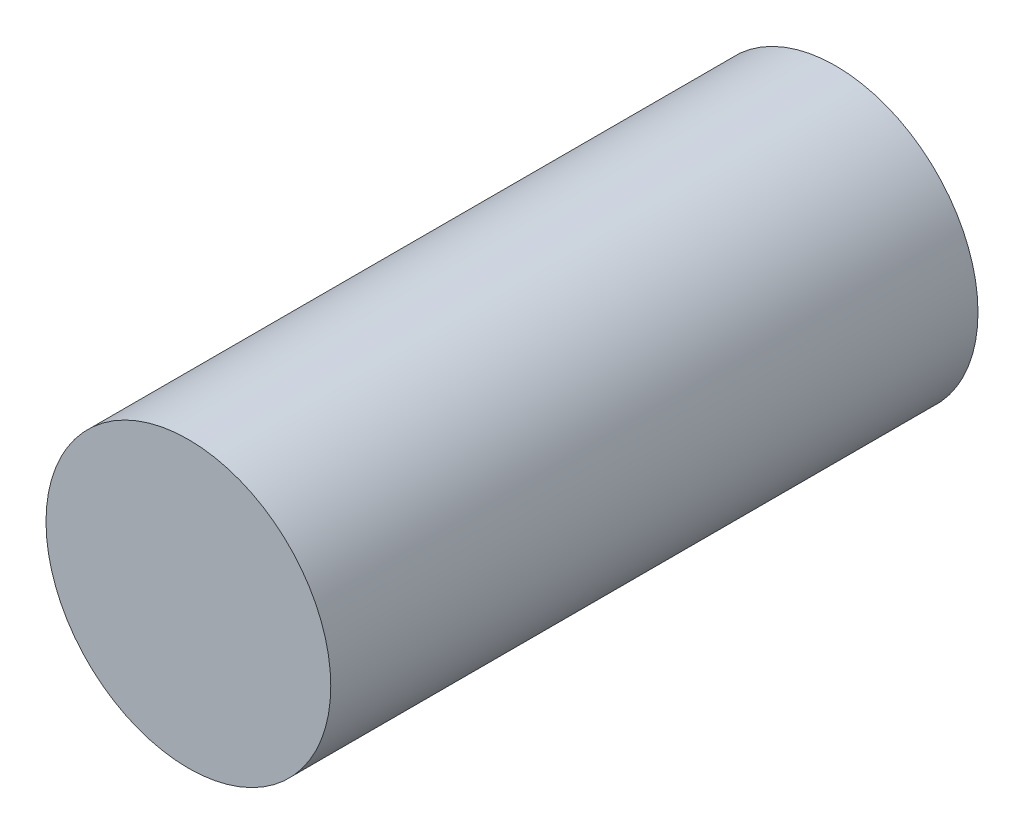
ISO-10303-21;
HEADER;
FILE_DESCRIPTION(('STEP AP214'),'2;1');
FILE_NAME('part.step','',(''),(''),'','','');
FILE_SCHEMA(('AUTOMOTIVE_DESIGN { 1 0 10303 214 1 1 1 1 }'));
ENDSEC;
DATA;
#1=APPLICATION_CONTEXT('core data for automotive mechanical design processes');
#2=APPLICATION_PROTOCOL_DEFINITION('international standard','automotive_design',2000,#1);
#3=PRODUCT_CONTEXT('',#1,'mechanical');
#4=PRODUCT('Part','Part','',(#3));
#5=PRODUCT_RELATED_PRODUCT_CATEGORY('part','',(#4));
#6=PRODUCT_DEFINITION_FORMATION('','',#4);
#7=PRODUCT_DEFINITION_CONTEXT('part definition',#1,'design');
#8=PRODUCT_DEFINITION('design','',#6,#7);
#9=PRODUCT_DEFINITION_SHAPE('','',#8);
#10=(LENGTH_UNIT() NAMED_UNIT(*) SI_UNIT(.MILLI.,.METRE.));
#11=(NAMED_UNIT(*) PLANE_ANGLE_UNIT() SI_UNIT($,.RADIAN.));
#12=(NAMED_UNIT(*) SI_UNIT($,.STERADIAN.) SOLID_ANGLE_UNIT());
#13=UNCERTAINTY_MEASURE_WITH_UNIT(LENGTH_MEASURE(1.E-05),#10,'distance_accuracy_value','');
#14=(GEOMETRIC_REPRESENTATION_CONTEXT(3) GLOBAL_UNCERTAINTY_ASSIGNED_CONTEXT((#13)) GLOBAL_UNIT_ASSIGNED_CONTEXT((#10,
#11,#12)) REPRESENTATION_CONTEXT('',''));
#15=CARTESIAN_POINT('',(0.,0.,0.));
#16=DIRECTION('',(0.,0.,1.));
#17=DIRECTION('',(1.,0.,0.));
#18=AXIS2_PLACEMENT_3D('',#15,#16,#17);
#19=CARTESIAN_POINT('',(0.,0.,125.));
#20=DIRECTION('',(0.,0.,-1.));
#21=DIRECTION('',(-1.,0.,0.));
#22=AXIS2_PLACEMENT_3D('',#19,#20,#21);
#23=CYLINDRICAL_SURFACE('',#22,27.5);
#24=CARTESIAN_POINT('',(0.,0.,125.));
#25=DIRECTION('',(0.,0.,1.));
#26=DIRECTION('',(1.,0.,0.));
#27=AXIS2_PLACEMENT_3D('',#24,#25,#26);
#28=CIRCLE('',#27,27.5);
#29=CARTESIAN_POINT('',(27.5,0.,125.));
#30=VERTEX_POINT('',#29);
#31=EDGE_CURVE('E10',#30,#30,#28,.T.);
#32=ORIENTED_EDGE('',*,*,#31,.F.);
#33=EDGE_LOOP('',(#32));
#34=FACE_BOUND('',#33,.T.);
#35=CARTESIAN_POINT('',(0.,0.,0.));
#36=DIRECTION('',(0.,0.,1.));
#37=DIRECTION('',(1.,0.,0.));
#38=AXIS2_PLACEMENT_3D('',#35,#36,#37);
#39=CIRCLE('',#38,27.5);
#40=CARTESIAN_POINT('',(27.5,0.,0.));
#41=VERTEX_POINT('',#40);
#42=EDGE_CURVE('E38',#41,#41,#39,.T.);
#43=ORIENTED_EDGE('',*,*,#42,.T.);
#44=EDGE_LOOP('',(#43));
#45=FACE_BOUND('',#44,.T.);
#46=ADVANCED_FACE('F35',(#34,#45),#23,.T.);
#47=CARTESIAN_POINT('',(0.,0.,125.));
#48=DIRECTION('',(0.,0.,1.));
#49=DIRECTION('',(1.,0.,0.));
#50=AXIS2_PLACEMENT_3D('',#47,#48,#49);
#51=PLANE('',#50);
#52=ORIENTED_EDGE('',*,*,#31,.T.);
#53=EDGE_LOOP('',(#52));
#54=FACE_BOUND('',#53,.T.);
#55=ADVANCED_FACE('F50',(#54),#51,.T.);
#56=CARTESIAN_POINT('',(0.,0.,0.));
#57=DIRECTION('',(0.,0.,1.));
#58=DIRECTION('',(1.,0.,0.));
#59=AXIS2_PLACEMENT_3D('',#56,#57,#58);
#60=PLANE('',#59);
#61=ORIENTED_EDGE('',*,*,#42,.F.);
#62=EDGE_LOOP('',(#61));
#63=FACE_BOUND('',#62,.T.);
#64=ADVANCED_FACE('F48',(#63),#60,.F.);
#65=CLOSED_SHELL('',(#46,#55,#64));
#66=MANIFOLD_SOLID_BREP('B2',#65);
#67=ADVANCED_BREP_SHAPE_REPRESENTATION('',(#18,#66),#14);
#68=SHAPE_DEFINITION_REPRESENTATION(#9,#67);
ENDSEC;
END-ISO-10303-21;
